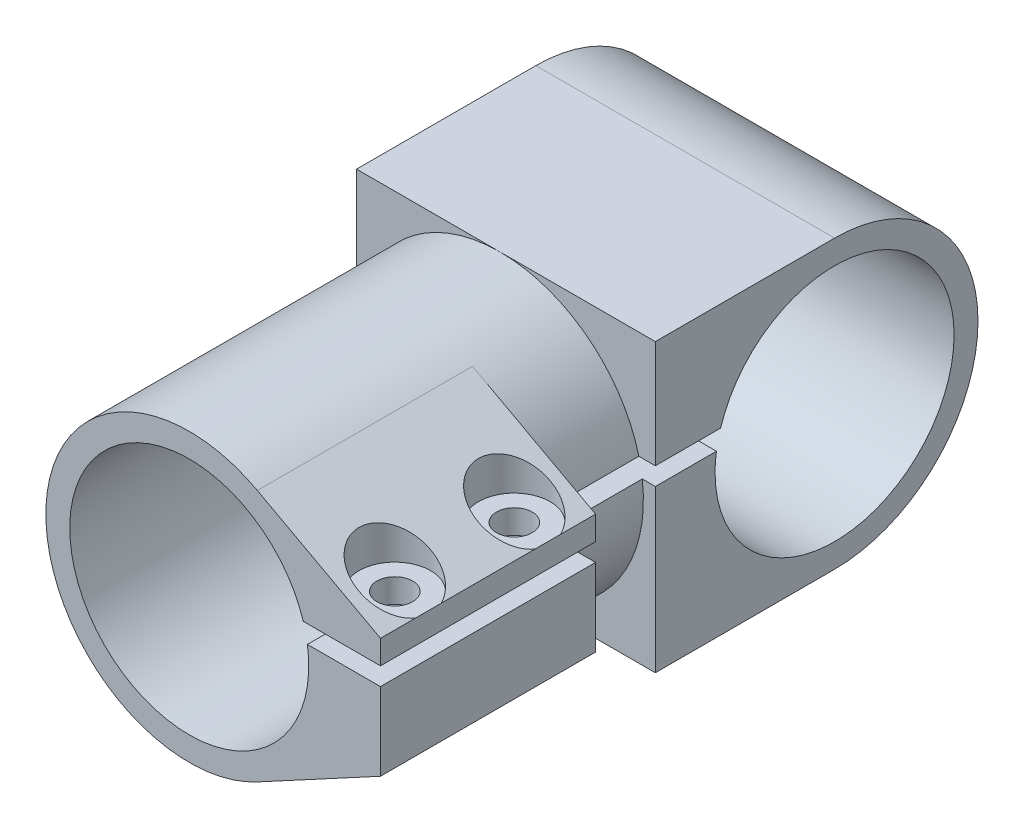
ISO-10303-21;
HEADER;
FILE_DESCRIPTION(('STEP AP214'),'2;1');
FILE_NAME('part.step','',(''),(''),'','','');
FILE_SCHEMA(('AUTOMOTIVE_DESIGN { 1 0 10303 214 1 1 1 1 }'));
ENDSEC;
DATA;
#1=APPLICATION_CONTEXT('core data for automotive mechanical design processes');
#2=APPLICATION_PROTOCOL_DEFINITION('international standard','automotive_design',2000,#1);
#3=PRODUCT_CONTEXT('',#1,'mechanical');
#4=PRODUCT('Part','Part','',(#3));
#5=PRODUCT_RELATED_PRODUCT_CATEGORY('part','',(#4));
#6=PRODUCT_DEFINITION_FORMATION('','',#4);
#7=PRODUCT_DEFINITION_CONTEXT('part definition',#1,'design');
#8=PRODUCT_DEFINITION('design','',#6,#7);
#9=PRODUCT_DEFINITION_SHAPE('','',#8);
#10=(LENGTH_UNIT() NAMED_UNIT(*) SI_UNIT(.MILLI.,.METRE.));
#11=(NAMED_UNIT(*) PLANE_ANGLE_UNIT() SI_UNIT($,.RADIAN.));
#12=(NAMED_UNIT(*) SI_UNIT($,.STERADIAN.) SOLID_ANGLE_UNIT());
#13=UNCERTAINTY_MEASURE_WITH_UNIT(LENGTH_MEASURE(1.E-05),#10,'distance_accuracy_value','');
#14=(GEOMETRIC_REPRESENTATION_CONTEXT(3) GLOBAL_UNCERTAINTY_ASSIGNED_CONTEXT((#13)) GLOBAL_UNIT_ASSIGNED_CONTEXT((#10,
#11,#12)) REPRESENTATION_CONTEXT('',''));
#15=CARTESIAN_POINT('',(0.,0.,0.));
#16=DIRECTION('',(0.,0.,1.));
#17=DIRECTION('',(1.,0.,0.));
#18=AXIS2_PLACEMENT_3D('',#15,#16,#17);
#19=CARTESIAN_POINT('',(16.,1.5,26.));
#20=DIRECTION('',(0.,-1.,0.));
#21=DIRECTION('',(1.,0.,0.));
#22=AXIS2_PLACEMENT_3D('',#19,#20,#21);
#23=PLANE('',#22);
#24=CARTESIAN_POINT('',(13.2,1.5,22.));
#25=DIRECTION('',(0.,-1.,0.));
#26=DIRECTION('',(1.,0.,0.));
#27=AXIS2_PLACEMENT_3D('',#24,#25,#26);
#28=CIRCLE('',#27,1.2);
#29=CARTESIAN_POINT('',(14.4,1.5,22.));
#30=VERTEX_POINT('',#29);
#31=EDGE_CURVE('E191',#30,#30,#28,.T.);
#32=ORIENTED_EDGE('',*,*,#31,.T.);
#33=EDGE_LOOP('',(#32));
#34=FACE_BOUND('',#33,.T.);
#35=CARTESIAN_POINT('',(13.2,1.5,12.));
#36=DIRECTION('',(0.,-1.,0.));
#37=DIRECTION('',(1.,0.,0.));
#38=AXIS2_PLACEMENT_3D('',#35,#36,#37);
#39=CIRCLE('',#38,1.2);
#40=CARTESIAN_POINT('',(14.4,1.5,12.));
#41=VERTEX_POINT('',#40);
#42=EDGE_CURVE('E37',#41,#41,#39,.T.);
#43=ORIENTED_EDGE('',*,*,#42,.T.);
#44=EDGE_LOOP('',(#43));
#45=FACE_BOUND('',#44,.T.);
#46=DIRECTION('',(0.,0.,-1.));
#47=VECTOR('',#46,1.);
#48=CARTESIAN_POINT('',(0.500000000000018,1.5,26.));
#49=LINE('',#48,#47);
#50=CARTESIAN_POINT('',(0.500000000000018,1.5,0.));
#51=VERTEX_POINT('',#50);
#52=CARTESIAN_POINT('',(0.500000000000018,1.5,-5.11314003335741));
#53=VERTEX_POINT('',#52);
#54=EDGE_CURVE('E180',#51,#53,#49,.T.);
#55=ORIENTED_EDGE('',*,*,#54,.F.);
#56=DIRECTION('',(-1.,0.,0.));
#57=VECTOR('',#56,1.);
#58=CARTESIAN_POINT('',(13.,1.5,0.));
#59=LINE('',#58,#57);
#60=CARTESIAN_POINT('',(9.88685996664259,1.5,0.));
#61=VERTEX_POINT('',#60);
#62=EDGE_CURVE('E207',#61,#51,#59,.T.);
#63=ORIENTED_EDGE('',*,*,#62,.F.);
#64=DIRECTION('',(0.,0.,-1.));
#65=VECTOR('',#64,1.);
#66=CARTESIAN_POINT('',(9.88685996664259,1.5,26.));
#67=LINE('',#66,#65);
#68=CARTESIAN_POINT('',(9.88685996664259,1.5,26.));
#69=VERTEX_POINT('',#68);
#70=EDGE_CURVE('E254',#69,#61,#67,.T.);
#71=ORIENTED_EDGE('',*,*,#70,.F.);
#72=DIRECTION('',(-1.,0.,0.));
#73=VECTOR('',#72,1.);
#74=CARTESIAN_POINT('',(16.,1.5,26.));
#75=LINE('',#74,#73);
#76=CARTESIAN_POINT('',(16.,1.5,26.));
#77=VERTEX_POINT('',#76);
#78=EDGE_CURVE('E226',#77,#69,#75,.T.);
#79=ORIENTED_EDGE('',*,*,#78,.F.);
#80=DIRECTION('',(0.,0.,-1.));
#81=VECTOR('',#80,1.);
#82=CARTESIAN_POINT('',(16.,1.5,26.));
#83=LINE('',#82,#81);
#84=CARTESIAN_POINT('',(16.,1.5,8.));
#85=VERTEX_POINT('',#84);
#86=EDGE_CURVE('E256',#77,#85,#83,.T.);
#87=ORIENTED_EDGE('',*,*,#86,.T.);
#88=DIRECTION('',(-1.,0.,0.));
#89=VECTOR('',#88,1.);
#90=CARTESIAN_POINT('',(16.,1.5,8.));
#91=LINE('',#90,#89);
#92=CARTESIAN_POINT('',(11.9058808997906,1.5,8.));
#93=VERTEX_POINT('',#92);
#94=EDGE_CURVE('E321',#85,#93,#91,.T.);
#95=ORIENTED_EDGE('',*,*,#94,.T.);
#96=DIRECTION('',(0.,0.,-1.));
#97=VECTOR('',#96,1.);
#98=CARTESIAN_POINT('',(11.9058808997906,1.5,8.));
#99=LINE('',#98,#97);
#100=CARTESIAN_POINT('',(11.9058808997906,1.5,0.));
#101=VERTEX_POINT('',#100);
#102=EDGE_CURVE('E312',#93,#101,#99,.T.);
#103=ORIENTED_EDGE('',*,*,#102,.T.);
#104=DIRECTION('',(-1.,0.,0.));
#105=VECTOR('',#104,1.);
#106=CARTESIAN_POINT('',(16.,1.5,0.));
#107=LINE('',#106,#105);
#108=CARTESIAN_POINT('',(13.,1.5,0.));
#109=VERTEX_POINT('',#108);
#110=EDGE_CURVE('E306',#109,#101,#107,.T.);
#111=ORIENTED_EDGE('',*,*,#110,.F.);
#112=DIRECTION('',(0.,0.,1.));
#113=VECTOR('',#112,1.);
#114=CARTESIAN_POINT('',(13.,1.5,0.));
#115=LINE('',#114,#113);
#116=CARTESIAN_POINT('',(13.,1.5,-5.11314003335741));
#117=VERTEX_POINT('',#116);
#118=EDGE_CURVE('E206',#117,#109,#115,.T.);
#119=ORIENTED_EDGE('',*,*,#118,.F.);
#120=DIRECTION('',(-1.,0.,0.));
#121=VECTOR('',#120,1.);
#122=CARTESIAN_POINT('',(13.,1.5,-5.11314003335741));
#123=LINE('',#122,#121);
#124=EDGE_CURVE('E199',#117,#53,#123,.T.);
#125=ORIENTED_EDGE('',*,*,#124,.T.);
#126=EDGE_LOOP('',(#55,#63,#71,#79,#87,#95,#103,#111,#119,#125));
#127=FACE_BOUND('',#126,.T.);
#128=ADVANCED_FACE('F33',(#34,#45,#127),#23,.F.);
#129=CARTESIAN_POINT('',(16.,3.,26.));
#130=DIRECTION('',(0.,1.,0.));
#131=DIRECTION('',(0.,0.,1.));
#132=AXIS2_PLACEMENT_3D('',#129,#130,#131);
#133=PLANE('',#132);
#134=CARTESIAN_POINT('',(13.2,3.,22.));
#135=DIRECTION('',(0.,1.,0.));
#136=DIRECTION('',(0.,0.,1.));
#137=AXIS2_PLACEMENT_3D('',#134,#135,#136);
#138=CIRCLE('',#137,1.5);
#139=CARTESIAN_POINT('',(13.2,3.,23.5));
#140=VERTEX_POINT('',#139);
#141=EDGE_CURVE('E295',#140,#140,#138,.T.);
#142=ORIENTED_EDGE('',*,*,#141,.T.);
#143=EDGE_LOOP('',(#142));
#144=FACE_BOUND('',#143,.T.);
#145=CARTESIAN_POINT('',(13.2,3.,12.));
#146=DIRECTION('',(0.,1.,0.));
#147=DIRECTION('',(0.,0.,1.));
#148=AXIS2_PLACEMENT_3D('',#145,#146,#147);
#149=CIRCLE('',#148,1.5);
#150=CARTESIAN_POINT('',(13.2,3.,13.5));
#151=VERTEX_POINT('',#150);
#152=EDGE_CURVE('E290',#151,#151,#149,.T.);
#153=ORIENTED_EDGE('',*,*,#152,.T.);
#154=EDGE_LOOP('',(#153));
#155=FACE_BOUND('',#154,.T.);
#156=DIRECTION('',(0.,0.,1.));
#157=VECTOR('',#156,1.);
#158=CARTESIAN_POINT('',(0.500000000000018,3.,26.));
#159=LINE('',#158,#157);
#160=CARTESIAN_POINT('',(0.500000000000018,3.,-5.46060798583054));
#161=VERTEX_POINT('',#160);
#162=CARTESIAN_POINT('',(0.500000000000018,3.,0.));
#163=VERTEX_POINT('',#162);
#164=EDGE_CURVE('E192',#161,#163,#159,.T.);
#165=ORIENTED_EDGE('',*,*,#164,.F.);
#166=DIRECTION('',(-1.,0.,0.));
#167=VECTOR('',#166,1.);
#168=CARTESIAN_POINT('',(13.,3.,-5.46060798583054));
#169=LINE('',#168,#167);
#170=CARTESIAN_POINT('',(13.,3.,-5.46060798583054));
#171=VERTEX_POINT('',#170);
#172=EDGE_CURVE('E202',#171,#161,#169,.T.);
#173=ORIENTED_EDGE('',*,*,#172,.F.);
#174=DIRECTION('',(0.,0.,-1.));
#175=VECTOR('',#174,1.);
#176=CARTESIAN_POINT('',(13.,3.,0.));
#177=LINE('',#176,#175);
#178=CARTESIAN_POINT('',(13.,3.,0.));
#179=VERTEX_POINT('',#178);
#180=EDGE_CURVE('E331',#179,#171,#177,.T.);
#181=ORIENTED_EDGE('',*,*,#180,.F.);
#182=DIRECTION('',(1.,0.,0.));
#183=VECTOR('',#182,1.);
#184=CARTESIAN_POINT('',(16.,3.,0.));
#185=LINE('',#184,#183);
#186=CARTESIAN_POINT('',(11.6189500386222,3.,0.));
#187=VERTEX_POINT('',#186);
#188=EDGE_CURVE('E304',#187,#179,#185,.T.);
#189=ORIENTED_EDGE('',*,*,#188,.F.);
#190=DIRECTION('',(0.,0.,-1.));
#191=VECTOR('',#190,1.);
#192=CARTESIAN_POINT('',(11.6189500386222,3.,8.));
#193=LINE('',#192,#191);
#194=CARTESIAN_POINT('',(11.6189500386222,3.,8.));
#195=VERTEX_POINT('',#194);
#196=EDGE_CURVE('E309',#187,#195,#193,.F.);
#197=ORIENTED_EDGE('',*,*,#196,.T.);
#198=DIRECTION('',(1.,0.,0.));
#199=VECTOR('',#198,1.);
#200=CARTESIAN_POINT('',(16.,3.,8.));
#201=LINE('',#200,#199);
#202=CARTESIAN_POINT('',(16.,3.,8.));
#203=VERTEX_POINT('',#202);
#204=EDGE_CURVE('E318',#195,#203,#201,.T.);
#205=ORIENTED_EDGE('',*,*,#204,.T.);
#206=DIRECTION('',(0.,0.,-1.));
#207=VECTOR('',#206,1.);
#208=CARTESIAN_POINT('',(16.,3.,26.));
#209=LINE('',#208,#207);
#210=CARTESIAN_POINT('',(16.,3.,26.));
#211=VERTEX_POINT('',#210);
#212=EDGE_CURVE('E247',#211,#203,#209,.T.);
#213=ORIENTED_EDGE('',*,*,#212,.F.);
#214=DIRECTION('',(1.,0.,0.));
#215=VECTOR('',#214,1.);
#216=CARTESIAN_POINT('',(16.,3.,26.));
#217=LINE('',#216,#215);
#218=CARTESIAN_POINT('',(9.53939201416946,3.,26.));
#219=VERTEX_POINT('',#218);
#220=EDGE_CURVE('E230',#219,#211,#217,.T.);
#221=ORIENTED_EDGE('',*,*,#220,.F.);
#222=DIRECTION('',(0.,0.,-1.));
#223=VECTOR('',#222,1.);
#224=CARTESIAN_POINT('',(9.53939201416946,3.,26.));
#225=LINE('',#224,#223);
#226=CARTESIAN_POINT('',(9.53939201416946,3.,0.));
#227=VERTEX_POINT('',#226);
#228=EDGE_CURVE('E251',#219,#227,#225,.T.);
#229=ORIENTED_EDGE('',*,*,#228,.T.);
#230=DIRECTION('',(-1.,0.,0.));
#231=VECTOR('',#230,1.);
#232=CARTESIAN_POINT('',(13.,3.,0.));
#233=LINE('',#232,#231);
#234=EDGE_CURVE('E209',#227,#163,#233,.T.);
#235=ORIENTED_EDGE('',*,*,#234,.T.);
#236=EDGE_LOOP('',(#165,#173,#181,#189,#197,#205,#213,#221,#229,#235));
#237=FACE_BOUND('',#236,.T.);
#238=ADVANCED_FACE('F411',(#144,#155,#237),#133,.F.);
#239=CARTESIAN_POINT('',(0.,0.,26.));
#240=DIRECTION('',(0.,0.,-1.));
#241=DIRECTION('',(-1.,0.,0.));
#242=AXIS2_PLACEMENT_3D('',#239,#240,#241);
#243=CYLINDRICAL_SURFACE('',#242,12.);
#244=DIRECTION('',(0.,0.,-1.));
#245=VECTOR('',#244,1.);
#246=CARTESIAN_POINT('',(5.70006407600292,10.5597949567906,26.));
#247=LINE('',#246,#245);
#248=CARTESIAN_POINT('',(5.70006407600292,10.5597949567906,26.));
#249=VERTEX_POINT('',#248);
#250=CARTESIAN_POINT('',(5.70006407600291,10.5597949567906,8.));
#251=VERTEX_POINT('',#250);
#252=EDGE_CURVE('E236',#249,#251,#247,.T.);
#253=ORIENTED_EDGE('',*,*,#252,.T.);
#254=CARTESIAN_POINT('',(0.,0.,8.));
#255=DIRECTION('',(0.,0.,1.));
#256=DIRECTION('',(1.,0.,0.));
#257=AXIS2_PLACEMENT_3D('',#254,#255,#256);
#258=CIRCLE('',#257,12.);
#259=EDGE_CURVE('E303',#195,#251,#258,.T.);
#260=ORIENTED_EDGE('',*,*,#259,.F.);
#261=ORIENTED_EDGE('',*,*,#196,.F.);
#262=CARTESIAN_POINT('',(0.,0.,0.));
#263=DIRECTION('',(0.,0.,1.));
#264=DIRECTION('',(1.,0.,0.));
#265=AXIS2_PLACEMENT_3D('',#262,#263,#264);
#266=CIRCLE('',#265,12.);
#267=CARTESIAN_POINT('',(0.,12.,0.));
#268=VERTEX_POINT('',#267);
#269=EDGE_CURVE('E237',#187,#268,#266,.T.);
#270=ORIENTED_EDGE('',*,*,#269,.T.);
#271=CARTESIAN_POINT('',(-12.,0.,0.));
#272=VERTEX_POINT('',#271);
#273=EDGE_CURVE('E239',#268,#272,#266,.T.);
#274=ORIENTED_EDGE('',*,*,#273,.T.);
#275=CARTESIAN_POINT('',(0.,-12.,0.));
#276=VERTEX_POINT('',#275);
#277=EDGE_CURVE('E382',#272,#276,#266,.T.);
#278=ORIENTED_EDGE('',*,*,#277,.T.);
#279=EDGE_CURVE('E217',#276,#101,#266,.T.);
#280=ORIENTED_EDGE('',*,*,#279,.T.);
#281=ORIENTED_EDGE('',*,*,#102,.F.);
#282=CARTESIAN_POINT('',(5.70006407600291,-10.5597949567906,8.));
#283=VERTEX_POINT('',#282);
#284=EDGE_CURVE('E299',#283,#93,#258,.T.);
#285=ORIENTED_EDGE('',*,*,#284,.F.);
#286=DIRECTION('',(0.,0.,-1.));
#287=VECTOR('',#286,1.);
#288=CARTESIAN_POINT('',(5.70006407600292,-10.5597949567906,26.));
#289=LINE('',#288,#287);
#290=CARTESIAN_POINT('',(5.70006407600292,-10.5597949567906,26.));
#291=VERTEX_POINT('',#290);
#292=EDGE_CURVE('E262',#291,#283,#289,.T.);
#293=ORIENTED_EDGE('',*,*,#292,.F.);
#294=CARTESIAN_POINT('',(0.,0.,26.));
#295=DIRECTION('',(0.,0.,1.));
#296=DIRECTION('',(1.,0.,0.));
#297=AXIS2_PLACEMENT_3D('',#294,#295,#296);
#298=CIRCLE('',#297,12.);
#299=EDGE_CURVE('E218',#249,#291,#298,.T.);
#300=ORIENTED_EDGE('',*,*,#299,.F.);
#301=EDGE_LOOP('',(#253,#260,#261,#270,#274,#278,#280,#281,#285,#293,#300));
#302=FACE_BOUND('',#301,.T.);
#303=ADVANCED_FACE('F35',(#302),#243,.T.);
#304=CARTESIAN_POINT('',(16.,-5.,26.));
#305=DIRECTION('',(-0.475005339666909,0.879982913065887,0.));
#306=DIRECTION('',(-0.879982913065887,-0.475005339666909,0.));
#307=AXIS2_PLACEMENT_3D('',#304,#305,#306);
#308=PLANE('',#307);
#309=CARTESIAN_POINT('',(13.2,-6.51140997321588,12.));
#310=DIRECTION('',(-0.475005339666909,0.879982913065887,0.));
#311=DIRECTION('',(0.879982913065887,0.475005339666909,0.));
#312=AXIS2_PLACEMENT_3D('',#309,#310,#311);
#313=ELLIPSE('',#312,1.36366284183765,1.2);
#314=CARTESIAN_POINT('',(14.4,-5.86366284183765,12.));
#315=VERTEX_POINT('',#314);
#316=EDGE_CURVE('E281',#315,#315,#313,.T.);
#317=ORIENTED_EDGE('',*,*,#316,.T.);
#318=EDGE_LOOP('',(#317));
#319=FACE_BOUND('',#318,.T.);
#320=CARTESIAN_POINT('',(13.2,-6.51140997321588,22.));
#321=DIRECTION('',(-0.475005339666909,0.879982913065887,0.));
#322=DIRECTION('',(0.879982913065887,0.475005339666909,0.));
#323=AXIS2_PLACEMENT_3D('',#320,#321,#322);
#324=ELLIPSE('',#323,1.36366284183765,1.2);
#325=CARTESIAN_POINT('',(14.4,-5.86366284183765,22.));
#326=VERTEX_POINT('',#325);
#327=EDGE_CURVE('E273',#326,#326,#324,.T.);
#328=ORIENTED_EDGE('',*,*,#327,.T.);
#329=EDGE_LOOP('',(#328));
#330=FACE_BOUND('',#329,.T.);
#331=ORIENTED_EDGE('',*,*,#292,.T.);
#332=DIRECTION('',(0.879982913065887,0.475005339666909,0.));
#333=VECTOR('',#332,1.);
#334=CARTESIAN_POINT('',(16.,-5.,8.));
#335=LINE('',#334,#333);
#336=CARTESIAN_POINT('',(16.,-5.,8.));
#337=VERTEX_POINT('',#336);
#338=EDGE_CURVE('E327',#283,#337,#335,.T.);
#339=ORIENTED_EDGE('',*,*,#338,.T.);
#340=DIRECTION('',(0.,0.,-1.));
#341=VECTOR('',#340,1.);
#342=CARTESIAN_POINT('',(16.,-5.,26.));
#343=LINE('',#342,#341);
#344=CARTESIAN_POINT('',(16.,-5.,26.));
#345=VERTEX_POINT('',#344);
#346=EDGE_CURVE('E259',#345,#337,#343,.T.);
#347=ORIENTED_EDGE('',*,*,#346,.F.);
#348=DIRECTION('',(0.879982913065887,0.475005339666909,0.));
#349=VECTOR('',#348,1.);
#350=CARTESIAN_POINT('',(16.,-5.,26.));
#351=LINE('',#350,#349);
#352=EDGE_CURVE('E221',#291,#345,#351,.T.);
#353=ORIENTED_EDGE('',*,*,#352,.F.);
#354=EDGE_LOOP('',(#331,#339,#347,#353));
#355=FACE_BOUND('',#354,.T.);
#356=ADVANCED_FACE('F438',(#319,#330,#355),#308,.F.);
#357=CARTESIAN_POINT('',(16.,1.5,26.));
#358=DIRECTION('',(-1.,0.,0.));
#359=DIRECTION('',(0.,0.,1.));
#360=AXIS2_PLACEMENT_3D('',#357,#358,#359);
#361=PLANE('',#360);
#362=ORIENTED_EDGE('',*,*,#346,.T.);
#363=DIRECTION('',(0.,1.,0.));
#364=VECTOR('',#363,1.);
#365=CARTESIAN_POINT('',(16.,1.5,8.));
#366=LINE('',#365,#364);
#367=EDGE_CURVE('E324',#337,#85,#366,.T.);
#368=ORIENTED_EDGE('',*,*,#367,.T.);
#369=ORIENTED_EDGE('',*,*,#86,.F.);
#370=DIRECTION('',(0.,1.,0.));
#371=VECTOR('',#370,1.);
#372=CARTESIAN_POINT('',(16.,1.5,26.));
#373=LINE('',#372,#371);
#374=EDGE_CURVE('E224',#345,#77,#373,.T.);
#375=ORIENTED_EDGE('',*,*,#374,.F.);
#376=EDGE_LOOP('',(#362,#368,#369,#375));
#377=FACE_BOUND('',#376,.T.);
#378=ADVANCED_FACE('F431',(#377),#361,.F.);
#379=CARTESIAN_POINT('',(0.,0.,26.));
#380=DIRECTION('',(0.,0.,-1.));
#381=DIRECTION('',(-1.,0.,0.));
#382=AXIS2_PLACEMENT_3D('',#379,#380,#381);
#383=CYLINDRICAL_SURFACE('',#382,10.);
#384=CARTESIAN_POINT('',(0.,0.,0.));
#385=DIRECTION('',(0.,0.,-1.));
#386=DIRECTION('',(1.,0.,0.));
#387=AXIS2_PLACEMENT_3D('',#384,#385,#386);
#388=CIRCLE('',#387,10.);
#389=EDGE_CURVE('E222',#61,#227,#388,.T.);
#390=ORIENTED_EDGE('',*,*,#389,.T.);
#391=ORIENTED_EDGE('',*,*,#228,.F.);
#392=CARTESIAN_POINT('',(0.,0.,26.));
#393=DIRECTION('',(0.,0.,-1.));
#394=DIRECTION('',(1.,0.,0.));
#395=AXIS2_PLACEMENT_3D('',#392,#393,#394);
#396=CIRCLE('',#395,10.);
#397=EDGE_CURVE('E228',#69,#219,#396,.T.);
#398=ORIENTED_EDGE('',*,*,#397,.F.);
#399=ORIENTED_EDGE('',*,*,#70,.T.);
#400=EDGE_LOOP('',(#390,#391,#398,#399));
#401=FACE_BOUND('',#400,.T.);
#402=ADVANCED_FACE('F422',(#401),#383,.F.);
#403=CARTESIAN_POINT('',(16.,5.,26.));
#404=DIRECTION('',(-1.,0.,0.));
#405=DIRECTION('',(0.,0.,1.));
#406=AXIS2_PLACEMENT_3D('',#403,#404,#405);
#407=PLANE('',#406);
#408=ORIENTED_EDGE('',*,*,#212,.T.);
#409=DIRECTION('',(0.,1.,0.));
#410=VECTOR('',#409,1.);
#411=CARTESIAN_POINT('',(16.,5.,8.));
#412=LINE('',#411,#410);
#413=CARTESIAN_POINT('',(16.,5.,8.));
#414=VERTEX_POINT('',#413);
#415=EDGE_CURVE('E315',#203,#414,#412,.T.);
#416=ORIENTED_EDGE('',*,*,#415,.T.);
#417=DIRECTION('',(0.,0.,-1.));
#418=VECTOR('',#417,1.);
#419=CARTESIAN_POINT('',(16.,5.,26.));
#420=LINE('',#419,#418);
#421=CARTESIAN_POINT('',(16.,5.,10.9229670385731));
#422=VERTEX_POINT('',#421);
#423=EDGE_CURVE('E243',#422,#414,#420,.T.);
#424=ORIENTED_EDGE('',*,*,#423,.F.);
#425=CARTESIAN_POINT('',(16.,5.,13.0770329614269));
#426=VERTEX_POINT('',#425);
#427=EDGE_CURVE('E458',#426,#422,#420,.T.);
#428=ORIENTED_EDGE('',*,*,#427,.F.);
#429=CARTESIAN_POINT('',(16.,5.,20.9229670385731));
#430=VERTEX_POINT('',#429);
#431=EDGE_CURVE('E456',#430,#426,#420,.T.);
#432=ORIENTED_EDGE('',*,*,#431,.F.);
#433=CARTESIAN_POINT('',(16.,5.,23.0770329614269));
#434=VERTEX_POINT('',#433);
#435=EDGE_CURVE('E248',#434,#430,#420,.T.);
#436=ORIENTED_EDGE('',*,*,#435,.F.);
#437=CARTESIAN_POINT('',(16.,5.,26.));
#438=VERTEX_POINT('',#437);
#439=EDGE_CURVE('E244',#438,#434,#420,.T.);
#440=ORIENTED_EDGE('',*,*,#439,.F.);
#441=DIRECTION('',(0.,1.,0.));
#442=VECTOR('',#441,1.);
#443=CARTESIAN_POINT('',(16.,5.,26.));
#444=LINE('',#443,#442);
#445=EDGE_CURVE('E232',#211,#438,#444,.T.);
#446=ORIENTED_EDGE('',*,*,#445,.F.);
#447=EDGE_LOOP('',(#408,#416,#424,#428,#432,#436,#440,#446));
#448=FACE_BOUND('',#447,.T.);
#449=ADVANCED_FACE('F450',(#448),#407,.F.);
#450=CARTESIAN_POINT('',(5.70006407600292,10.5597949567906,26.));
#451=DIRECTION('',(-0.475005339666909,-0.879982913065887,0.));
#452=DIRECTION('',(0.879982913065887,-0.475005339666909,0.));
#453=AXIS2_PLACEMENT_3D('',#450,#451,#452);
#454=PLANE('',#453);
#455=ORIENTED_EDGE('',*,*,#431,.T.);
#456=CARTESIAN_POINT('',(13.2,6.51140997321588,12.));
#457=DIRECTION('',(-0.475005339666909,-0.879982913065887,0.));
#458=DIRECTION('',(0.879982913065887,-0.475005339666909,0.));
#459=AXIS2_PLACEMENT_3D('',#456,#457,#458);
#460=ELLIPSE('',#459,3.40915710459412,3.);
#461=EDGE_CURVE('E11',#426,#422,#460,.T.);
#462=ORIENTED_EDGE('',*,*,#461,.T.);
#463=ORIENTED_EDGE('',*,*,#423,.T.);
#464=DIRECTION('',(-0.879982913065887,0.475005339666909,0.));
#465=VECTOR('',#464,1.);
#466=CARTESIAN_POINT('',(5.70006407600292,10.5597949567906,8.));
#467=LINE('',#466,#465);
#468=EDGE_CURVE('E268',#414,#251,#467,.T.);
#469=ORIENTED_EDGE('',*,*,#468,.T.);
#470=ORIENTED_EDGE('',*,*,#252,.F.);
#471=DIRECTION('',(-0.879982913065887,0.475005339666909,0.));
#472=VECTOR('',#471,1.);
#473=CARTESIAN_POINT('',(5.70006407600292,10.5597949567906,26.));
#474=LINE('',#473,#472);
#475=EDGE_CURVE('E234',#438,#249,#474,.T.);
#476=ORIENTED_EDGE('',*,*,#475,.F.);
#477=ORIENTED_EDGE('',*,*,#439,.T.);
#478=CARTESIAN_POINT('',(13.2,6.51140997321588,22.));
#479=DIRECTION('',(-0.475005339666909,-0.879982913065887,0.));
#480=DIRECTION('',(0.879982913065887,-0.475005339666909,0.));
#481=AXIS2_PLACEMENT_3D('',#478,#479,#480);
#482=ELLIPSE('',#481,3.40915710459412,3.);
#483=EDGE_CURVE('E42',#434,#430,#482,.T.);
#484=ORIENTED_EDGE('',*,*,#483,.T.);
#485=EDGE_LOOP('',(#455,#462,#463,#469,#470,#476,#477,#484));
#486=FACE_BOUND('',#485,.T.);
#487=ADVANCED_FACE('F444',(#486),#454,.F.);
#488=CARTESIAN_POINT('',(0.,0.,26.));
#489=DIRECTION('',(0.,0.,1.));
#490=DIRECTION('',(1.,0.,0.));
#491=AXIS2_PLACEMENT_3D('',#488,#489,#490);
#492=PLANE('',#491);
#493=ORIENTED_EDGE('',*,*,#299,.T.);
#494=ORIENTED_EDGE('',*,*,#352,.T.);
#495=ORIENTED_EDGE('',*,*,#374,.T.);
#496=ORIENTED_EDGE('',*,*,#78,.T.);
#497=ORIENTED_EDGE('',*,*,#397,.T.);
#498=ORIENTED_EDGE('',*,*,#220,.T.);
#499=ORIENTED_EDGE('',*,*,#445,.T.);
#500=ORIENTED_EDGE('',*,*,#475,.T.);
#501=EDGE_LOOP('',(#493,#494,#495,#496,#497,#498,#499,#500));
#502=FACE_BOUND('',#501,.T.);
#503=ADVANCED_FACE('F425',(#502),#492,.T.);
#504=CARTESIAN_POINT('',(13.,1.5,0.));
#505=DIRECTION('',(0.,0.,-1.));
#506=DIRECTION('',(0.,1.,0.));
#507=AXIS2_PLACEMENT_3D('',#504,#505,#506);
#508=PLANE('',#507);
#509=DIRECTION('',(0.,-1.,0.));
#510=VECTOR('',#509,1.);
#511=CARTESIAN_POINT('',(-12.,1.5,0.));
#512=LINE('',#511,#510);
#513=CARTESIAN_POINT('',(-12.,12.,0.));
#514=VERTEX_POINT('',#513);
#515=EDGE_CURVE('E350',#514,#272,#512,.T.);
#516=ORIENTED_EDGE('',*,*,#515,.T.);
#517=ORIENTED_EDGE('',*,*,#273,.F.);
#518=DIRECTION('',(-1.,0.,0.));
#519=VECTOR('',#518,1.);
#520=CARTESIAN_POINT('',(13.,12.,0.));
#521=LINE('',#520,#519);
#522=EDGE_CURVE('E346',#268,#514,#521,.T.);
#523=ORIENTED_EDGE('',*,*,#522,.T.);
#524=EDGE_LOOP('',(#516,#517,#523));
#525=FACE_BOUND('',#524,.T.);
#526=ADVANCED_FACE('F403',(#525),#508,.F.);
#527=DIRECTION('',(-1.,0.,0.));
#528=VECTOR('',#527,1.);
#529=CARTESIAN_POINT('',(13.,-12.,0.));
#530=LINE('',#529,#528);
#531=CARTESIAN_POINT('',(-12.,-12.,0.));
#532=VERTEX_POINT('',#531);
#533=EDGE_CURVE('E367',#276,#532,#530,.T.);
#534=ORIENTED_EDGE('',*,*,#533,.F.);
#535=ORIENTED_EDGE('',*,*,#277,.F.);
#536=EDGE_CURVE('E349',#272,#532,#512,.T.);
#537=ORIENTED_EDGE('',*,*,#536,.T.);
#538=EDGE_LOOP('',(#534,#535,#537));
#539=FACE_BOUND('',#538,.T.);
#540=ADVANCED_FACE('F381',(#539),#508,.F.);
#541=ORIENTED_EDGE('',*,*,#279,.F.);
#542=CARTESIAN_POINT('',(13.,-12.,0.));
#543=VERTEX_POINT('',#542);
#544=EDGE_CURVE('E211',#543,#276,#530,.T.);
#545=ORIENTED_EDGE('',*,*,#544,.F.);
#546=DIRECTION('',(0.,-1.,0.));
#547=VECTOR('',#546,1.);
#548=CARTESIAN_POINT('',(13.,1.5,0.));
#549=LINE('',#548,#547);
#550=EDGE_CURVE('E337',#109,#543,#549,.T.);
#551=ORIENTED_EDGE('',*,*,#550,.F.);
#552=ORIENTED_EDGE('',*,*,#110,.T.);
#553=EDGE_LOOP('',(#541,#545,#551,#552));
#554=FACE_BOUND('',#553,.T.);
#555=ADVANCED_FACE('F396',(#554),#508,.F.);
#556=ORIENTED_EDGE('',*,*,#234,.F.);
#557=ORIENTED_EDGE('',*,*,#389,.F.);
#558=ORIENTED_EDGE('',*,*,#62,.T.);
#559=DIRECTION('',(0.,1.,0.));
#560=VECTOR('',#559,1.);
#561=CARTESIAN_POINT('',(0.500000000000018,12.,0.));
#562=LINE('',#561,#560);
#563=EDGE_CURVE('E186',#51,#163,#562,.T.);
#564=ORIENTED_EDGE('',*,*,#563,.T.);
#565=EDGE_LOOP('',(#556,#557,#558,#564));
#566=FACE_BOUND('',#565,.T.);
#567=ADVANCED_FACE('F415',(#566),#508,.F.);
#568=CARTESIAN_POINT('',(13.,12.,0.));
#569=DIRECTION('',(0.,0.,-1.));
#570=DIRECTION('',(0.,1.,0.));
#571=AXIS2_PLACEMENT_3D('',#568,#569,#570);
#572=PLANE('',#571);
#573=CARTESIAN_POINT('',(13.,12.,0.));
#574=VERTEX_POINT('',#573);
#575=EDGE_CURVE('E361',#574,#268,#521,.T.);
#576=ORIENTED_EDGE('',*,*,#575,.T.);
#577=ORIENTED_EDGE('',*,*,#269,.F.);
#578=ORIENTED_EDGE('',*,*,#188,.T.);
#579=DIRECTION('',(0.,-1.,0.));
#580=VECTOR('',#579,1.);
#581=CARTESIAN_POINT('',(13.,0.,0.));
#582=LINE('',#581,#580);
#583=EDGE_CURVE('E265',#574,#179,#582,.T.);
#584=ORIENTED_EDGE('',*,*,#583,.F.);
#585=EDGE_LOOP('',(#576,#577,#578,#584));
#586=FACE_BOUND('',#585,.T.);
#587=ADVANCED_FACE('F574',(#586),#572,.F.);
#588=CARTESIAN_POINT('',(13.,0.,-15.));
#589=DIRECTION('',(-1.,0.,0.));
#590=DIRECTION('',(0.,0.,1.));
#591=AXIS2_PLACEMENT_3D('',#588,#589,#590);
#592=CYLINDRICAL_SURFACE('',#591,10.);
#593=CARTESIAN_POINT('',(-12.,0.,-15.));
#594=DIRECTION('',(-1.,0.,0.));
#595=DIRECTION('',(0.,0.,1.));
#596=AXIS2_PLACEMENT_3D('',#593,#594,#595);
#597=CIRCLE('',#596,10.);
#598=CARTESIAN_POINT('',(-12.,0.,-5.));
#599=VERTEX_POINT('',#598);
#600=EDGE_CURVE('E330',#599,#599,#597,.T.);
#601=ORIENTED_EDGE('',*,*,#600,.T.);
#602=EDGE_LOOP('',(#601));
#603=FACE_BOUND('',#602,.T.);
#604=CARTESIAN_POINT('',(0.500000000000018,0.,-15.));
#605=DIRECTION('',(-1.,0.,0.));
#606=DIRECTION('',(0.,0.,1.));
#607=AXIS2_PLACEMENT_3D('',#604,#605,#606);
#608=CIRCLE('',#607,10.);
#609=EDGE_CURVE('E183',#53,#161,#608,.T.);
#610=ORIENTED_EDGE('',*,*,#609,.F.);
#611=ORIENTED_EDGE('',*,*,#124,.F.);
#612=CARTESIAN_POINT('',(13.,0.,-15.));
#613=DIRECTION('',(-1.,0.,0.));
#614=DIRECTION('',(0.,0.,1.));
#615=AXIS2_PLACEMENT_3D('',#612,#613,#614);
#616=CIRCLE('',#615,10.);
#617=EDGE_CURVE('E333',#171,#117,#616,.T.);
#618=ORIENTED_EDGE('',*,*,#617,.F.);
#619=ORIENTED_EDGE('',*,*,#172,.T.);
#620=EDGE_LOOP('',(#610,#611,#618,#619));
#621=FACE_BOUND('',#620,.T.);
#622=ADVANCED_FACE('F197',(#603,#621),#592,.F.);
#623=CARTESIAN_POINT('',(13.,-12.,0.));
#624=DIRECTION('',(0.,1.,0.));
#625=DIRECTION('',(0.,0.,1.));
#626=AXIS2_PLACEMENT_3D('',#623,#624,#625);
#627=PLANE('',#626);
#628=DIRECTION('',(0.,0.,-1.));
#629=VECTOR('',#628,1.);
#630=CARTESIAN_POINT('',(-12.,-12.,0.));
#631=LINE('',#630,#629);
#632=CARTESIAN_POINT('',(-12.,-12.,-15.));
#633=VERTEX_POINT('',#632);
#634=EDGE_CURVE('E353',#532,#633,#631,.T.);
#635=ORIENTED_EDGE('',*,*,#634,.T.);
#636=DIRECTION('',(-1.,0.,0.));
#637=VECTOR('',#636,1.);
#638=CARTESIAN_POINT('',(13.,-12.,-15.));
#639=LINE('',#638,#637);
#640=CARTESIAN_POINT('',(13.,-12.,-15.));
#641=VERTEX_POINT('',#640);
#642=EDGE_CURVE('E366',#641,#633,#639,.T.);
#643=ORIENTED_EDGE('',*,*,#642,.F.);
#644=DIRECTION('',(0.,0.,-1.));
#645=VECTOR('',#644,1.);
#646=CARTESIAN_POINT('',(13.,-12.,0.));
#647=LINE('',#646,#645);
#648=EDGE_CURVE('E339',#543,#641,#647,.T.);
#649=ORIENTED_EDGE('',*,*,#648,.F.);
#650=ORIENTED_EDGE('',*,*,#544,.T.);
#651=ORIENTED_EDGE('',*,*,#533,.T.);
#652=EDGE_LOOP('',(#635,#643,#649,#650,#651));
#653=FACE_BOUND('',#652,.T.);
#654=ADVANCED_FACE('F374',(#653),#627,.F.);
#655=CARTESIAN_POINT('',(13.,0.,-15.));
#656=DIRECTION('',(-1.,0.,0.));
#657=DIRECTION('',(0.,0.,1.));
#658=AXIS2_PLACEMENT_3D('',#655,#656,#657);
#659=CYLINDRICAL_SURFACE('',#658,12.);
#660=CARTESIAN_POINT('',(-12.,0.,-15.));
#661=DIRECTION('',(1.,0.,0.));
#662=DIRECTION('',(0.,0.,1.));
#663=AXIS2_PLACEMENT_3D('',#660,#661,#662);
#664=CIRCLE('',#663,12.);
#665=CARTESIAN_POINT('',(-12.,12.,-15.));
#666=VERTEX_POINT('',#665);
#667=EDGE_CURVE('E356',#633,#666,#664,.T.);
#668=ORIENTED_EDGE('',*,*,#667,.T.);
#669=DIRECTION('',(-1.,0.,0.));
#670=VECTOR('',#669,1.);
#671=CARTESIAN_POINT('',(13.,12.,-15.));
#672=LINE('',#671,#670);
#673=CARTESIAN_POINT('',(13.,12.,-15.));
#674=VERTEX_POINT('',#673);
#675=EDGE_CURVE('E364',#674,#666,#672,.T.);
#676=ORIENTED_EDGE('',*,*,#675,.F.);
#677=CARTESIAN_POINT('',(13.,0.,-15.));
#678=DIRECTION('',(1.,0.,0.));
#679=DIRECTION('',(0.,0.,1.));
#680=AXIS2_PLACEMENT_3D('',#677,#678,#679);
#681=CIRCLE('',#680,12.);
#682=EDGE_CURVE('E341',#641,#674,#681,.T.);
#683=ORIENTED_EDGE('',*,*,#682,.F.);
#684=ORIENTED_EDGE('',*,*,#642,.T.);
#685=EDGE_LOOP('',(#668,#676,#683,#684));
#686=FACE_BOUND('',#685,.T.);
#687=ADVANCED_FACE('F389',(#686),#659,.T.);
#688=CARTESIAN_POINT('',(13.,12.,-15.));
#689=DIRECTION('',(0.,-1.,0.));
#690=DIRECTION('',(0.,0.,-1.));
#691=AXIS2_PLACEMENT_3D('',#688,#689,#690);
#692=PLANE('',#691);
#693=ORIENTED_EDGE('',*,*,#522,.F.);
#694=ORIENTED_EDGE('',*,*,#575,.F.);
#695=DIRECTION('',(0.,0.,1.));
#696=VECTOR('',#695,1.);
#697=CARTESIAN_POINT('',(13.,12.,-15.));
#698=LINE('',#697,#696);
#699=EDGE_CURVE('E343',#674,#574,#698,.T.);
#700=ORIENTED_EDGE('',*,*,#699,.F.);
#701=ORIENTED_EDGE('',*,*,#675,.T.);
#702=DIRECTION('',(0.,0.,1.));
#703=VECTOR('',#702,1.);
#704=CARTESIAN_POINT('',(-12.,12.,-15.));
#705=LINE('',#704,#703);
#706=EDGE_CURVE('E334',#666,#514,#705,.T.);
#707=ORIENTED_EDGE('',*,*,#706,.T.);
#708=EDGE_LOOP('',(#693,#694,#700,#701,#707));
#709=FACE_BOUND('',#708,.T.);
#710=ADVANCED_FACE('F406',(#709),#692,.F.);
#711=CARTESIAN_POINT('',(13.,0.,-15.));
#712=DIRECTION('',(-1.,0.,0.));
#713=DIRECTION('',(0.,0.,1.));
#714=AXIS2_PLACEMENT_3D('',#711,#712,#713);
#715=PLANE('',#714);
#716=ORIENTED_EDGE('',*,*,#699,.T.);
#717=ORIENTED_EDGE('',*,*,#583,.T.);
#718=ORIENTED_EDGE('',*,*,#180,.T.);
#719=ORIENTED_EDGE('',*,*,#617,.T.);
#720=ORIENTED_EDGE('',*,*,#118,.T.);
#721=ORIENTED_EDGE('',*,*,#550,.T.);
#722=ORIENTED_EDGE('',*,*,#648,.T.);
#723=ORIENTED_EDGE('',*,*,#682,.T.);
#724=EDGE_LOOP('',(#716,#717,#718,#719,#720,#721,#722,#723));
#725=FACE_BOUND('',#724,.T.);
#726=ADVANCED_FACE('F393',(#725),#715,.F.);
#727=CARTESIAN_POINT('',(-12.,0.,-15.));
#728=DIRECTION('',(-1.,0.,0.));
#729=DIRECTION('',(0.,0.,1.));
#730=AXIS2_PLACEMENT_3D('',#727,#728,#729);
#731=PLANE('',#730);
#732=ORIENTED_EDGE('',*,*,#515,.F.);
#733=ORIENTED_EDGE('',*,*,#706,.F.);
#734=ORIENTED_EDGE('',*,*,#667,.F.);
#735=ORIENTED_EDGE('',*,*,#634,.F.);
#736=ORIENTED_EDGE('',*,*,#536,.F.);
#737=EDGE_LOOP('',(#732,#733,#734,#735,#736));
#738=FACE_BOUND('',#737,.T.);
#739=ORIENTED_EDGE('',*,*,#600,.F.);
#740=EDGE_LOOP('',(#739));
#741=FACE_BOUND('',#740,.T.);
#742=ADVANCED_FACE('F384',(#738,#741),#731,.T.);
#743=CARTESIAN_POINT('',(0.,0.,8.));
#744=DIRECTION('',(0.,0.,1.));
#745=DIRECTION('',(1.,0.,0.));
#746=AXIS2_PLACEMENT_3D('',#743,#744,#745);
#747=PLANE('',#746);
#748=ORIENTED_EDGE('',*,*,#259,.T.);
#749=ORIENTED_EDGE('',*,*,#468,.F.);
#750=ORIENTED_EDGE('',*,*,#415,.F.);
#751=ORIENTED_EDGE('',*,*,#204,.F.);
#752=EDGE_LOOP('',(#748,#749,#750,#751));
#753=FACE_BOUND('',#752,.T.);
#754=ADVANCED_FACE('F448',(#753),#747,.F.);
#755=ORIENTED_EDGE('',*,*,#284,.T.);
#756=ORIENTED_EDGE('',*,*,#94,.F.);
#757=ORIENTED_EDGE('',*,*,#367,.F.);
#758=ORIENTED_EDGE('',*,*,#338,.F.);
#759=EDGE_LOOP('',(#755,#756,#757,#758));
#760=FACE_BOUND('',#759,.T.);
#761=ADVANCED_FACE('F433',(#760),#747,.F.);
#762=CARTESIAN_POINT('',(13.2,12.,22.));
#763=DIRECTION('',(0.,-1.,0.));
#764=DIRECTION('',(0.,0.,-1.));
#765=AXIS2_PLACEMENT_3D('',#762,#763,#764);
#766=CYLINDRICAL_SURFACE('',#765,3.);
#767=CARTESIAN_POINT('',(13.2,5.,22.));
#768=DIRECTION('',(0.,-1.,0.));
#769=DIRECTION('',(0.,0.,-1.));
#770=AXIS2_PLACEMENT_3D('',#767,#768,#769);
#771=CIRCLE('',#770,3.);
#772=EDGE_CURVE('E56',#434,#430,#771,.T.);
#773=ORIENTED_EDGE('',*,*,#772,.T.);
#774=ORIENTED_EDGE('',*,*,#483,.F.);
#775=EDGE_LOOP('',(#773,#774));
#776=FACE_BOUND('',#775,.T.);
#777=ADVANCED_FACE('F472',(#776),#766,.F.);
#778=CARTESIAN_POINT('',(13.2,5.,22.));
#779=DIRECTION('',(0.,-1.,0.));
#780=DIRECTION('',(0.,0.,-1.));
#781=AXIS2_PLACEMENT_3D('',#778,#779,#780);
#782=PLANE('',#781);
#783=CARTESIAN_POINT('',(13.2,5.,22.));
#784=DIRECTION('',(0.,1.,0.));
#785=DIRECTION('',(0.,0.,1.));
#786=AXIS2_PLACEMENT_3D('',#783,#784,#785);
#787=CIRCLE('',#786,1.5);
#788=CARTESIAN_POINT('',(13.2,5.,23.5));
#789=VERTEX_POINT('',#788);
#790=EDGE_CURVE('E286',#789,#789,#787,.T.);
#791=ORIENTED_EDGE('',*,*,#790,.F.);
#792=EDGE_LOOP('',(#791));
#793=FACE_BOUND('',#792,.T.);
#794=ORIENTED_EDGE('',*,*,#772,.F.);
#795=ORIENTED_EDGE('',*,*,#435,.T.);
#796=EDGE_LOOP('',(#794,#795));
#797=FACE_BOUND('',#796,.T.);
#798=ADVANCED_FACE('F463',(#793,#797),#782,.F.);
#799=CARTESIAN_POINT('',(13.2,12.,12.));
#800=DIRECTION('',(0.,-1.,0.));
#801=DIRECTION('',(0.,0.,-1.));
#802=AXIS2_PLACEMENT_3D('',#799,#800,#801);
#803=CYLINDRICAL_SURFACE('',#802,3.);
#804=CARTESIAN_POINT('',(13.2,5.,12.));
#805=DIRECTION('',(0.,-1.,0.));
#806=DIRECTION('',(0.,0.,-1.));
#807=AXIS2_PLACEMENT_3D('',#804,#805,#806);
#808=CIRCLE('',#807,3.);
#809=EDGE_CURVE('E49',#426,#422,#808,.T.);
#810=ORIENTED_EDGE('',*,*,#809,.T.);
#811=ORIENTED_EDGE('',*,*,#461,.F.);
#812=EDGE_LOOP('',(#810,#811));
#813=FACE_BOUND('',#812,.T.);
#814=ADVANCED_FACE('F461',(#813),#803,.F.);
#815=CARTESIAN_POINT('',(13.2,5.,12.));
#816=DIRECTION('',(0.,-1.,0.));
#817=DIRECTION('',(0.,0.,-1.));
#818=AXIS2_PLACEMENT_3D('',#815,#816,#817);
#819=PLANE('',#818);
#820=CARTESIAN_POINT('',(13.2,5.,12.));
#821=DIRECTION('',(0.,1.,0.));
#822=DIRECTION('',(0.,0.,1.));
#823=AXIS2_PLACEMENT_3D('',#820,#821,#822);
#824=CIRCLE('',#823,1.5);
#825=CARTESIAN_POINT('',(13.2,5.,13.5));
#826=VERTEX_POINT('',#825);
#827=EDGE_CURVE('E287',#826,#826,#824,.T.);
#828=ORIENTED_EDGE('',*,*,#827,.F.);
#829=EDGE_LOOP('',(#828));
#830=FACE_BOUND('',#829,.T.);
#831=ORIENTED_EDGE('',*,*,#809,.F.);
#832=ORIENTED_EDGE('',*,*,#427,.T.);
#833=EDGE_LOOP('',(#831,#832));
#834=FACE_BOUND('',#833,.T.);
#835=ADVANCED_FACE('F459',(#830,#834),#819,.F.);
#836=CARTESIAN_POINT('',(13.2,1.5,12.));
#837=DIRECTION('',(0.,1.,0.));
#838=DIRECTION('',(0.,0.,1.));
#839=AXIS2_PLACEMENT_3D('',#836,#837,#838);
#840=CYLINDRICAL_SURFACE('',#839,1.5);
#841=ORIENTED_EDGE('',*,*,#827,.T.);
#842=EDGE_LOOP('',(#841));
#843=FACE_BOUND('',#842,.T.);
#844=ORIENTED_EDGE('',*,*,#152,.F.);
#845=EDGE_LOOP('',(#844));
#846=FACE_BOUND('',#845,.T.);
#847=ADVANCED_FACE('F469',(#843,#846),#840,.F.);
#848=CARTESIAN_POINT('',(13.2,1.5,22.));
#849=DIRECTION('',(0.,1.,0.));
#850=DIRECTION('',(0.,0.,1.));
#851=AXIS2_PLACEMENT_3D('',#848,#849,#850);
#852=CYLINDRICAL_SURFACE('',#851,1.5);
#853=ORIENTED_EDGE('',*,*,#790,.T.);
#854=EDGE_LOOP('',(#853));
#855=FACE_BOUND('',#854,.T.);
#856=ORIENTED_EDGE('',*,*,#141,.F.);
#857=EDGE_LOOP('',(#856));
#858=FACE_BOUND('',#857,.T.);
#859=ADVANCED_FACE('F505',(#855,#858),#852,.F.);
#860=CARTESIAN_POINT('',(13.2,-12.,22.));
#861=DIRECTION('',(0.,1.,0.));
#862=DIRECTION('',(-1.,0.,0.));
#863=AXIS2_PLACEMENT_3D('',#860,#861,#862);
#864=CYLINDRICAL_SURFACE('',#863,1.2);
#865=ORIENTED_EDGE('',*,*,#31,.F.);
#866=EDGE_LOOP('',(#865));
#867=FACE_BOUND('',#866,.T.);
#868=ORIENTED_EDGE('',*,*,#327,.F.);
#869=EDGE_LOOP('',(#868));
#870=FACE_BOUND('',#869,.T.);
#871=ADVANCED_FACE('F497',(#867,#870),#864,.F.);
#872=CARTESIAN_POINT('',(13.2,-12.,12.));
#873=DIRECTION('',(0.,1.,0.));
#874=DIRECTION('',(-1.,0.,0.));
#875=AXIS2_PLACEMENT_3D('',#872,#873,#874);
#876=CYLINDRICAL_SURFACE('',#875,1.2);
#877=ORIENTED_EDGE('',*,*,#42,.F.);
#878=EDGE_LOOP('',(#877));
#879=FACE_BOUND('',#878,.T.);
#880=ORIENTED_EDGE('',*,*,#316,.F.);
#881=EDGE_LOOP('',(#880));
#882=FACE_BOUND('',#881,.T.);
#883=ADVANCED_FACE('F495',(#879,#882),#876,.F.);
#884=CARTESIAN_POINT('',(0.500000000000018,0.,-15.));
#885=DIRECTION('',(-1.,0.,0.));
#886=DIRECTION('',(0.,0.,1.));
#887=AXIS2_PLACEMENT_3D('',#884,#885,#886);
#888=PLANE('',#887);
#889=ORIENTED_EDGE('',*,*,#563,.F.);
#890=ORIENTED_EDGE('',*,*,#54,.T.);
#891=ORIENTED_EDGE('',*,*,#609,.T.);
#892=ORIENTED_EDGE('',*,*,#164,.T.);
#893=EDGE_LOOP('',(#889,#890,#891,#892));
#894=FACE_BOUND('',#893,.T.);
#895=ADVANCED_FACE('F182',(#894),#888,.F.);
#896=CLOSED_SHELL('',(#128,#238,#303,#356,#378,#402,#449,#487,#503,#526,#540,#555,#567,#587,
#622,#654,#687,#710,#726,#742,#754,#761,#777,#798,#814,#835,#847,#859,#871,#883,#895));
#897=MANIFOLD_SOLID_BREP('B2',#896);
#898=ADVANCED_BREP_SHAPE_REPRESENTATION('',(#18,#897),#14);
#899=SHAPE_DEFINITION_REPRESENTATION(#9,#898);
ENDSEC;
END-ISO-10303-21;
